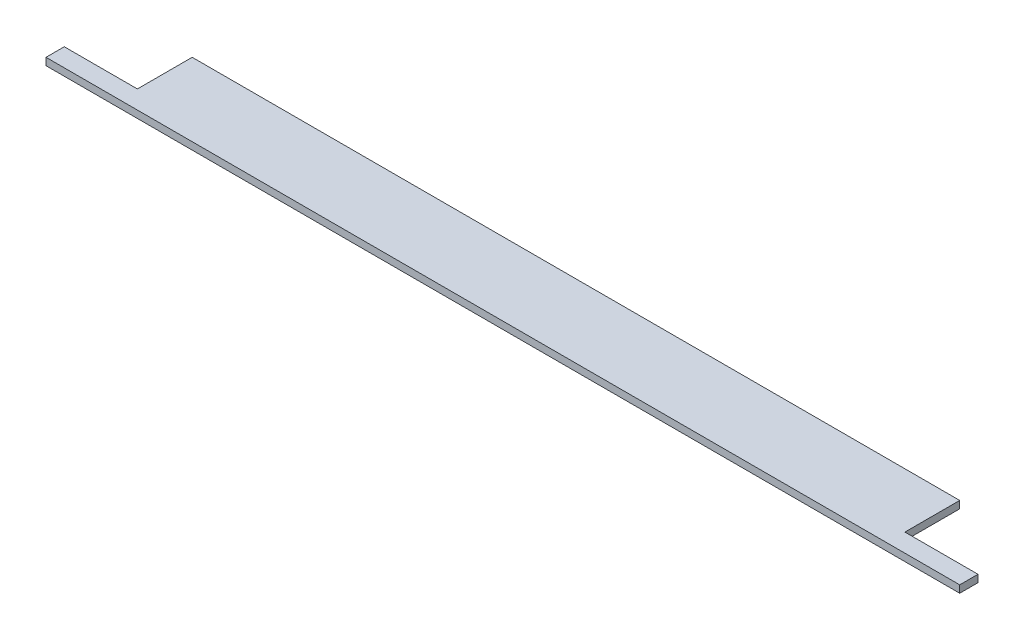
ISO-10303-21;
HEADER;
FILE_DESCRIPTION(('STEP AP214'),'2;1');
FILE_NAME('part.step','',(''),(''),'','','');
FILE_SCHEMA(('AUTOMOTIVE_DESIGN { 1 0 10303 214 1 1 1 1 }'));
ENDSEC;
DATA;
#1=APPLICATION_CONTEXT('core data for automotive mechanical design processes');
#2=APPLICATION_PROTOCOL_DEFINITION('international standard','automotive_design',2000,#1);
#3=PRODUCT_CONTEXT('',#1,'mechanical');
#4=PRODUCT('Part','Part','',(#3));
#5=PRODUCT_RELATED_PRODUCT_CATEGORY('part','',(#4));
#6=PRODUCT_DEFINITION_FORMATION('','',#4);
#7=PRODUCT_DEFINITION_CONTEXT('part definition',#1,'design');
#8=PRODUCT_DEFINITION('design','',#6,#7);
#9=PRODUCT_DEFINITION_SHAPE('','',#8);
#10=(LENGTH_UNIT() NAMED_UNIT(*) SI_UNIT(.MILLI.,.METRE.));
#11=(NAMED_UNIT(*) PLANE_ANGLE_UNIT() SI_UNIT($,.RADIAN.));
#12=(NAMED_UNIT(*) SI_UNIT($,.STERADIAN.) SOLID_ANGLE_UNIT());
#13=UNCERTAINTY_MEASURE_WITH_UNIT(LENGTH_MEASURE(1.E-05),#10,'distance_accuracy_value','');
#14=(GEOMETRIC_REPRESENTATION_CONTEXT(3) GLOBAL_UNCERTAINTY_ASSIGNED_CONTEXT((#13)) GLOBAL_UNIT_ASSIGNED_CONTEXT((#10,
#11,#12)) REPRESENTATION_CONTEXT('',''));
#15=CARTESIAN_POINT('',(0.,0.,0.));
#16=DIRECTION('',(0.,0.,1.));
#17=DIRECTION('',(1.,0.,0.));
#18=AXIS2_PLACEMENT_3D('',#15,#16,#17);
#19=CARTESIAN_POINT('',(0.,4.,0.));
#20=DIRECTION('',(1.,0.,0.));
#21=DIRECTION('',(0.,0.,-1.));
#22=AXIS2_PLACEMENT_3D('',#19,#20,#21);
#23=PLANE('',#22);
#24=DIRECTION('',(0.,0.,1.));
#25=VECTOR('',#24,1.);
#26=CARTESIAN_POINT('',(0.,4.,0.));
#27=LINE('',#26,#25);
#28=CARTESIAN_POINT('',(0.,4.,-10.));
#29=VERTEX_POINT('',#28);
#30=CARTESIAN_POINT('',(0.,4.,0.));
#31=VERTEX_POINT('',#30);
#32=EDGE_CURVE('E126',#29,#31,#27,.T.);
#33=ORIENTED_EDGE('',*,*,#32,.F.);
#34=DIRECTION('',(0.,1.,0.));
#35=VECTOR('',#34,1.);
#36=CARTESIAN_POINT('',(0.,0.,-10.));
#37=LINE('',#36,#35);
#38=CARTESIAN_POINT('',(0.,0.,-10.));
#39=VERTEX_POINT('',#38);
#40=EDGE_CURVE('E176',#39,#29,#37,.T.);
#41=ORIENTED_EDGE('',*,*,#40,.F.);
#42=DIRECTION('',(0.,0.,1.));
#43=VECTOR('',#42,1.);
#44=CARTESIAN_POINT('',(0.,0.,0.));
#45=LINE('',#44,#43);
#46=CARTESIAN_POINT('',(0.,0.,0.));
#47=VERTEX_POINT('',#46);
#48=EDGE_CURVE('E154',#39,#47,#45,.T.);
#49=ORIENTED_EDGE('',*,*,#48,.T.);
#50=DIRECTION('',(0.,-1.,0.));
#51=VECTOR('',#50,1.);
#52=CARTESIAN_POINT('',(0.,4.,0.));
#53=LINE('',#52,#51);
#54=EDGE_CURVE('E11',#31,#47,#53,.T.);
#55=ORIENTED_EDGE('',*,*,#54,.F.);
#56=EDGE_LOOP('',(#33,#41,#49,#55));
#57=FACE_BOUND('',#56,.T.);
#58=ADVANCED_FACE('F38',(#57),#23,.F.);
#59=CARTESIAN_POINT('',(0.,4.,0.));
#60=DIRECTION('',(0.,0.,-1.));
#61=DIRECTION('',(-1.,0.,0.));
#62=AXIS2_PLACEMENT_3D('',#59,#60,#61);
#63=PLANE('',#62);
#64=DIRECTION('',(1.,0.,0.));
#65=VECTOR('',#64,1.);
#66=CARTESIAN_POINT('',(0.,0.,0.));
#67=LINE('',#66,#65);
#68=CARTESIAN_POINT('',(500.,0.,0.));
#69=VERTEX_POINT('',#68);
#70=EDGE_CURVE('E134',#47,#69,#67,.T.);
#71=ORIENTED_EDGE('',*,*,#70,.T.);
#72=DIRECTION('',(0.,-1.,0.));
#73=VECTOR('',#72,1.);
#74=CARTESIAN_POINT('',(500.,4.,0.));
#75=LINE('',#74,#73);
#76=CARTESIAN_POINT('',(500.,4.,0.));
#77=VERTEX_POINT('',#76);
#78=EDGE_CURVE('E46',#77,#69,#75,.T.);
#79=ORIENTED_EDGE('',*,*,#78,.F.);
#80=DIRECTION('',(1.,0.,0.));
#81=VECTOR('',#80,1.);
#82=CARTESIAN_POINT('',(0.,4.,0.));
#83=LINE('',#82,#81);
#84=EDGE_CURVE('E131',#31,#77,#83,.T.);
#85=ORIENTED_EDGE('',*,*,#84,.F.);
#86=ORIENTED_EDGE('',*,*,#54,.T.);
#87=EDGE_LOOP('',(#71,#79,#85,#86));
#88=FACE_BOUND('',#87,.T.);
#89=ADVANCED_FACE('F160',(#88),#63,.F.);
#90=CARTESIAN_POINT('',(500.,4.,0.));
#91=DIRECTION('',(-1.,0.,0.));
#92=DIRECTION('',(0.,0.,1.));
#93=AXIS2_PLACEMENT_3D('',#90,#91,#92);
#94=PLANE('',#93);
#95=DIRECTION('',(0.,0.,-1.));
#96=VECTOR('',#95,1.);
#97=CARTESIAN_POINT('',(500.,0.,0.));
#98=LINE('',#97,#96);
#99=CARTESIAN_POINT('',(500.,0.,-10.));
#100=VERTEX_POINT('',#99);
#101=EDGE_CURVE('E127',#69,#100,#98,.T.);
#102=ORIENTED_EDGE('',*,*,#101,.T.);
#103=DIRECTION('',(0.,1.,0.));
#104=VECTOR('',#103,1.);
#105=CARTESIAN_POINT('',(500.,0.,-10.));
#106=LINE('',#105,#104);
#107=CARTESIAN_POINT('',(500.,4.,-10.));
#108=VERTEX_POINT('',#107);
#109=EDGE_CURVE('E166',#100,#108,#106,.T.);
#110=ORIENTED_EDGE('',*,*,#109,.T.);
#111=DIRECTION('',(0.,0.,-1.));
#112=VECTOR('',#111,1.);
#113=CARTESIAN_POINT('',(500.,4.,0.));
#114=LINE('',#113,#112);
#115=EDGE_CURVE('E144',#77,#108,#114,.T.);
#116=ORIENTED_EDGE('',*,*,#115,.F.);
#117=ORIENTED_EDGE('',*,*,#78,.T.);
#118=EDGE_LOOP('',(#102,#110,#116,#117));
#119=FACE_BOUND('',#118,.T.);
#120=ADVANCED_FACE('F165',(#119),#94,.F.);
#121=CARTESIAN_POINT('',(0.,4.,-40.));
#122=DIRECTION('',(0.,0.,1.));
#123=DIRECTION('',(1.,0.,0.));
#124=AXIS2_PLACEMENT_3D('',#121,#122,#123);
#125=PLANE('',#124);
#126=DIRECTION('',(-1.,0.,0.));
#127=VECTOR('',#126,1.);
#128=CARTESIAN_POINT('',(0.,4.,-40.));
#129=LINE('',#128,#127);
#130=CARTESIAN_POINT('',(460.,4.,-40.));
#131=VERTEX_POINT('',#130);
#132=CARTESIAN_POINT('',(40.,4.,-40.));
#133=VERTEX_POINT('',#132);
#134=EDGE_CURVE('E120',#131,#133,#129,.T.);
#135=ORIENTED_EDGE('',*,*,#134,.F.);
#136=DIRECTION('',(0.,1.,0.));
#137=VECTOR('',#136,1.);
#138=CARTESIAN_POINT('',(460.,0.,-40.));
#139=LINE('',#138,#137);
#140=CARTESIAN_POINT('',(460.,0.,-40.));
#141=VERTEX_POINT('',#140);
#142=EDGE_CURVE('E107',#141,#131,#139,.T.);
#143=ORIENTED_EDGE('',*,*,#142,.F.);
#144=DIRECTION('',(-1.,0.,0.));
#145=VECTOR('',#144,1.);
#146=CARTESIAN_POINT('',(0.,0.,-40.));
#147=LINE('',#146,#145);
#148=CARTESIAN_POINT('',(40.,0.,-40.));
#149=VERTEX_POINT('',#148);
#150=EDGE_CURVE('E119',#141,#149,#147,.T.);
#151=ORIENTED_EDGE('',*,*,#150,.T.);
#152=DIRECTION('',(0.,1.,0.));
#153=VECTOR('',#152,1.);
#154=CARTESIAN_POINT('',(40.,0.,-40.));
#155=LINE('',#154,#153);
#156=EDGE_CURVE('E156',#149,#133,#155,.T.);
#157=ORIENTED_EDGE('',*,*,#156,.T.);
#158=EDGE_LOOP('',(#135,#143,#151,#157));
#159=FACE_BOUND('',#158,.T.);
#160=ADVANCED_FACE('F117',(#159),#125,.F.);
#161=CARTESIAN_POINT('',(0.,4.,0.));
#162=DIRECTION('',(0.,-1.,0.));
#163=DIRECTION('',(0.,0.,-1.));
#164=AXIS2_PLACEMENT_3D('',#161,#162,#163);
#165=PLANE('',#164);
#166=ORIENTED_EDGE('',*,*,#115,.T.);
#167=DIRECTION('',(1.,0.,0.));
#168=VECTOR('',#167,1.);
#169=CARTESIAN_POINT('',(460.,4.,-10.));
#170=LINE('',#169,#168);
#171=CARTESIAN_POINT('',(460.,4.,-10.));
#172=VERTEX_POINT('',#171);
#173=EDGE_CURVE('E113',#172,#108,#170,.T.);
#174=ORIENTED_EDGE('',*,*,#173,.F.);
#175=DIRECTION('',(0.,0.,1.));
#176=VECTOR('',#175,1.);
#177=CARTESIAN_POINT('',(460.,4.,-40.));
#178=LINE('',#177,#176);
#179=EDGE_CURVE('E199',#131,#172,#178,.T.);
#180=ORIENTED_EDGE('',*,*,#179,.F.);
#181=ORIENTED_EDGE('',*,*,#134,.T.);
#182=DIRECTION('',(0.,0.,-1.));
#183=VECTOR('',#182,1.);
#184=CARTESIAN_POINT('',(40.,4.,-10.));
#185=LINE('',#184,#183);
#186=CARTESIAN_POINT('',(40.,4.,-10.));
#187=VERTEX_POINT('',#186);
#188=EDGE_CURVE('E184',#187,#133,#185,.T.);
#189=ORIENTED_EDGE('',*,*,#188,.F.);
#190=DIRECTION('',(1.,0.,0.));
#191=VECTOR('',#190,1.);
#192=CARTESIAN_POINT('',(0.,4.,-10.));
#193=LINE('',#192,#191);
#194=EDGE_CURVE('E168',#29,#187,#193,.T.);
#195=ORIENTED_EDGE('',*,*,#194,.F.);
#196=ORIENTED_EDGE('',*,*,#32,.T.);
#197=ORIENTED_EDGE('',*,*,#84,.T.);
#198=EDGE_LOOP('',(#166,#174,#180,#181,#189,#195,#196,#197));
#199=FACE_BOUND('',#198,.T.);
#200=ADVANCED_FACE('F171',(#199),#165,.F.);
#201=CARTESIAN_POINT('',(0.,0.,0.));
#202=DIRECTION('',(0.,-1.,0.));
#203=DIRECTION('',(0.,0.,-1.));
#204=AXIS2_PLACEMENT_3D('',#201,#202,#203);
#205=PLANE('',#204);
#206=DIRECTION('',(1.,0.,0.));
#207=VECTOR('',#206,1.);
#208=CARTESIAN_POINT('',(460.,0.,-10.));
#209=LINE('',#208,#207);
#210=CARTESIAN_POINT('',(460.,0.,-10.));
#211=VERTEX_POINT('',#210);
#212=EDGE_CURVE('E53',#211,#100,#209,.T.);
#213=ORIENTED_EDGE('',*,*,#212,.T.);
#214=ORIENTED_EDGE('',*,*,#101,.F.);
#215=ORIENTED_EDGE('',*,*,#70,.F.);
#216=ORIENTED_EDGE('',*,*,#48,.F.);
#217=DIRECTION('',(1.,0.,0.));
#218=VECTOR('',#217,1.);
#219=CARTESIAN_POINT('',(0.,0.,-10.));
#220=LINE('',#219,#218);
#221=CARTESIAN_POINT('',(40.,0.,-10.));
#222=VERTEX_POINT('',#221);
#223=EDGE_CURVE('E187',#39,#222,#220,.T.);
#224=ORIENTED_EDGE('',*,*,#223,.T.);
#225=DIRECTION('',(0.,0.,-1.));
#226=VECTOR('',#225,1.);
#227=CARTESIAN_POINT('',(40.,0.,-10.));
#228=LINE('',#227,#226);
#229=EDGE_CURVE('E61',#222,#149,#228,.T.);
#230=ORIENTED_EDGE('',*,*,#229,.T.);
#231=ORIENTED_EDGE('',*,*,#150,.F.);
#232=DIRECTION('',(0.,0.,1.));
#233=VECTOR('',#232,1.);
#234=CARTESIAN_POINT('',(460.,0.,-40.));
#235=LINE('',#234,#233);
#236=EDGE_CURVE('E103',#141,#211,#235,.T.);
#237=ORIENTED_EDGE('',*,*,#236,.T.);
#238=EDGE_LOOP('',(#213,#214,#215,#216,#224,#230,#231,#237));
#239=FACE_BOUND('',#238,.T.);
#240=ADVANCED_FACE('F123',(#239),#205,.T.);
#241=CARTESIAN_POINT('',(40.,0.,-10.));
#242=DIRECTION('',(1.,0.,0.));
#243=DIRECTION('',(0.,0.,-1.));
#244=AXIS2_PLACEMENT_3D('',#241,#242,#243);
#245=PLANE('',#244);
#246=ORIENTED_EDGE('',*,*,#188,.T.);
#247=ORIENTED_EDGE('',*,*,#156,.F.);
#248=ORIENTED_EDGE('',*,*,#229,.F.);
#249=DIRECTION('',(0.,1.,0.));
#250=VECTOR('',#249,1.);
#251=CARTESIAN_POINT('',(40.,0.,-10.));
#252=LINE('',#251,#250);
#253=EDGE_CURVE('E179',#222,#187,#252,.T.);
#254=ORIENTED_EDGE('',*,*,#253,.T.);
#255=EDGE_LOOP('',(#246,#247,#248,#254));
#256=FACE_BOUND('',#255,.T.);
#257=ADVANCED_FACE('F212',(#256),#245,.F.);
#258=CARTESIAN_POINT('',(0.,0.,-10.));
#259=DIRECTION('',(0.,0.,1.));
#260=DIRECTION('',(1.,0.,0.));
#261=AXIS2_PLACEMENT_3D('',#258,#259,#260);
#262=PLANE('',#261);
#263=ORIENTED_EDGE('',*,*,#194,.T.);
#264=ORIENTED_EDGE('',*,*,#253,.F.);
#265=ORIENTED_EDGE('',*,*,#223,.F.);
#266=ORIENTED_EDGE('',*,*,#40,.T.);
#267=EDGE_LOOP('',(#263,#264,#265,#266));
#268=FACE_BOUND('',#267,.T.);
#269=ADVANCED_FACE('F205',(#268),#262,.F.);
#270=CARTESIAN_POINT('',(460.,0.,-10.));
#271=DIRECTION('',(0.,0.,1.));
#272=DIRECTION('',(1.,0.,0.));
#273=AXIS2_PLACEMENT_3D('',#270,#271,#272);
#274=PLANE('',#273);
#275=ORIENTED_EDGE('',*,*,#173,.T.);
#276=ORIENTED_EDGE('',*,*,#109,.F.);
#277=ORIENTED_EDGE('',*,*,#212,.F.);
#278=DIRECTION('',(0.,1.,0.));
#279=VECTOR('',#278,1.);
#280=CARTESIAN_POINT('',(460.,0.,-10.));
#281=LINE('',#280,#279);
#282=EDGE_CURVE('E109',#211,#172,#281,.T.);
#283=ORIENTED_EDGE('',*,*,#282,.T.);
#284=EDGE_LOOP('',(#275,#276,#277,#283));
#285=FACE_BOUND('',#284,.T.);
#286=ADVANCED_FACE('F203',(#285),#274,.F.);
#287=CARTESIAN_POINT('',(460.,0.,-40.));
#288=DIRECTION('',(-1.,0.,0.));
#289=DIRECTION('',(0.,0.,1.));
#290=AXIS2_PLACEMENT_3D('',#287,#288,#289);
#291=PLANE('',#290);
#292=ORIENTED_EDGE('',*,*,#179,.T.);
#293=ORIENTED_EDGE('',*,*,#282,.F.);
#294=ORIENTED_EDGE('',*,*,#236,.F.);
#295=ORIENTED_EDGE('',*,*,#142,.T.);
#296=EDGE_LOOP('',(#292,#293,#294,#295));
#297=FACE_BOUND('',#296,.T.);
#298=ADVANCED_FACE('F106',(#297),#291,.F.);
#299=CLOSED_SHELL('',(#58,#89,#120,#160,#200,#240,#257,#269,#286,#298));
#300=MANIFOLD_SOLID_BREP('B2',#299);
#301=ADVANCED_BREP_SHAPE_REPRESENTATION('',(#18,#300),#14);
#302=SHAPE_DEFINITION_REPRESENTATION(#9,#301);
ENDSEC;
END-ISO-10303-21;
